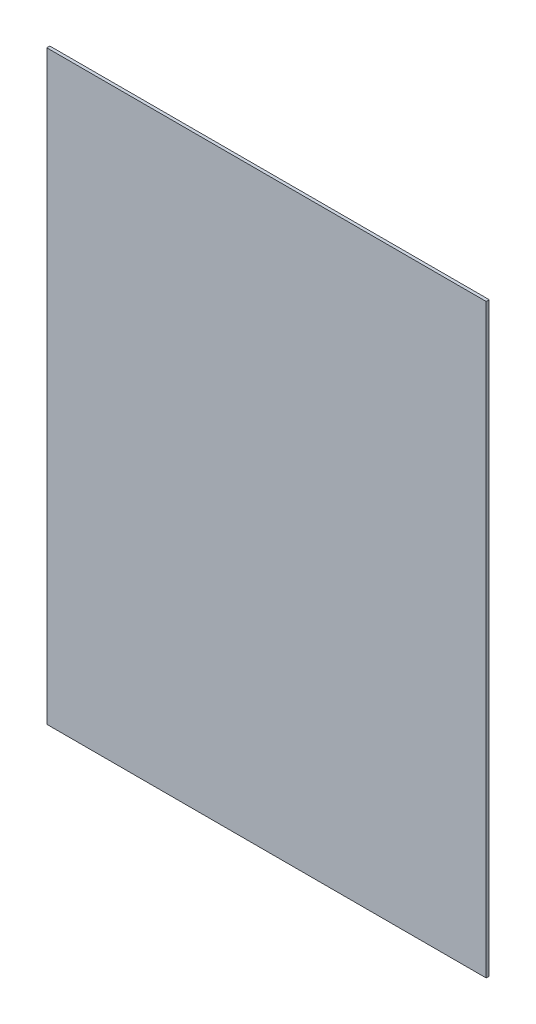
ISO-10303-21;
HEADER;
FILE_DESCRIPTION(('STEP AP214'),'2;1');
FILE_NAME('part.step','',(''),(''),'','','');
FILE_SCHEMA(('AUTOMOTIVE_DESIGN { 1 0 10303 214 1 1 1 1 }'));
ENDSEC;
DATA;
#1=APPLICATION_CONTEXT('core data for automotive mechanical design processes');
#2=APPLICATION_PROTOCOL_DEFINITION('international standard','automotive_design',2000,#1);
#3=PRODUCT_CONTEXT('',#1,'mechanical');
#4=PRODUCT('Part','Part','',(#3));
#5=PRODUCT_RELATED_PRODUCT_CATEGORY('part','',(#4));
#6=PRODUCT_DEFINITION_FORMATION('','',#4);
#7=PRODUCT_DEFINITION_CONTEXT('part definition',#1,'design');
#8=PRODUCT_DEFINITION('design','',#6,#7);
#9=PRODUCT_DEFINITION_SHAPE('','',#8);
#10=(LENGTH_UNIT() NAMED_UNIT(*) SI_UNIT(.MILLI.,.METRE.));
#11=(NAMED_UNIT(*) PLANE_ANGLE_UNIT() SI_UNIT($,.RADIAN.));
#12=(NAMED_UNIT(*) SI_UNIT($,.STERADIAN.) SOLID_ANGLE_UNIT());
#13=UNCERTAINTY_MEASURE_WITH_UNIT(LENGTH_MEASURE(1.E-05),#10,'distance_accuracy_value','');
#14=(GEOMETRIC_REPRESENTATION_CONTEXT(3) GLOBAL_UNCERTAINTY_ASSIGNED_CONTEXT((#13)) GLOBAL_UNIT_ASSIGNED_CONTEXT((#10,
#11,#12)) REPRESENTATION_CONTEXT('',''));
#15=CARTESIAN_POINT('',(0.,0.,0.));
#16=DIRECTION('',(0.,0.,1.));
#17=DIRECTION('',(1.,0.,0.));
#18=AXIS2_PLACEMENT_3D('',#15,#16,#17);
#19=CARTESIAN_POINT('',(457.2,609.6,6.35));
#20=DIRECTION('',(-1.,0.,0.));
#21=DIRECTION('',(0.,0.,1.));
#22=AXIS2_PLACEMENT_3D('',#19,#20,#21);
#23=PLANE('',#22);
#24=DIRECTION('',(0.,1.,0.));
#25=VECTOR('',#24,1.);
#26=CARTESIAN_POINT('',(457.2,609.6,0.));
#27=LINE('',#26,#25);
#28=CARTESIAN_POINT('',(457.2,-609.6,0.));
#29=VERTEX_POINT('',#28);
#30=CARTESIAN_POINT('',(457.2,609.6,0.));
#31=VERTEX_POINT('',#30);
#32=EDGE_CURVE('E99',#29,#31,#27,.T.);
#33=ORIENTED_EDGE('',*,*,#32,.T.);
#34=DIRECTION('',(0.,0.,-1.));
#35=VECTOR('',#34,1.);
#36=CARTESIAN_POINT('',(457.2,609.6,6.35));
#37=LINE('',#36,#35);
#38=CARTESIAN_POINT('',(457.2,609.6,6.35));
#39=VERTEX_POINT('',#38);
#40=EDGE_CURVE('E11',#39,#31,#37,.T.);
#41=ORIENTED_EDGE('',*,*,#40,.F.);
#42=DIRECTION('',(0.,1.,0.));
#43=VECTOR('',#42,1.);
#44=CARTESIAN_POINT('',(457.2,609.6,6.35));
#45=LINE('',#44,#43);
#46=CARTESIAN_POINT('',(457.2,-609.6,6.35));
#47=VERTEX_POINT('',#46);
#48=EDGE_CURVE('E87',#47,#39,#45,.T.);
#49=ORIENTED_EDGE('',*,*,#48,.F.);
#50=DIRECTION('',(0.,0.,-1.));
#51=VECTOR('',#50,1.);
#52=CARTESIAN_POINT('',(457.2,-609.6,6.35));
#53=LINE('',#52,#51);
#54=EDGE_CURVE('E95',#47,#29,#53,.T.);
#55=ORIENTED_EDGE('',*,*,#54,.T.);
#56=EDGE_LOOP('',(#33,#41,#49,#55));
#57=FACE_BOUND('',#56,.T.);
#58=ADVANCED_FACE('F36',(#57),#23,.F.);
#59=CARTESIAN_POINT('',(-457.2,609.6,6.35));
#60=DIRECTION('',(0.,-1.,0.));
#61=DIRECTION('',(0.,0.,-1.));
#62=AXIS2_PLACEMENT_3D('',#59,#60,#61);
#63=PLANE('',#62);
#64=DIRECTION('',(-1.,0.,0.));
#65=VECTOR('',#64,1.);
#66=CARTESIAN_POINT('',(-457.2,609.6,0.));
#67=LINE('',#66,#65);
#68=CARTESIAN_POINT('',(-457.2,609.6,0.));
#69=VERTEX_POINT('',#68);
#70=EDGE_CURVE('E91',#31,#69,#67,.T.);
#71=ORIENTED_EDGE('',*,*,#70,.T.);
#72=DIRECTION('',(0.,0.,-1.));
#73=VECTOR('',#72,1.);
#74=CARTESIAN_POINT('',(-457.2,609.6,6.35));
#75=LINE('',#74,#73);
#76=CARTESIAN_POINT('',(-457.2,609.6,6.35));
#77=VERTEX_POINT('',#76);
#78=EDGE_CURVE('E44',#77,#69,#75,.T.);
#79=ORIENTED_EDGE('',*,*,#78,.F.);
#80=DIRECTION('',(-1.,0.,0.));
#81=VECTOR('',#80,1.);
#82=CARTESIAN_POINT('',(-457.2,609.6,6.35));
#83=LINE('',#82,#81);
#84=EDGE_CURVE('E82',#39,#77,#83,.T.);
#85=ORIENTED_EDGE('',*,*,#84,.F.);
#86=ORIENTED_EDGE('',*,*,#40,.T.);
#87=EDGE_LOOP('',(#71,#79,#85,#86));
#88=FACE_BOUND('',#87,.T.);
#89=ADVANCED_FACE('F90',(#88),#63,.F.);
#90=CARTESIAN_POINT('',(-457.2,609.6,6.35));
#91=DIRECTION('',(1.,0.,0.));
#92=DIRECTION('',(0.,0.,-1.));
#93=AXIS2_PLACEMENT_3D('',#90,#91,#92);
#94=PLANE('',#93);
#95=DIRECTION('',(0.,-1.,0.));
#96=VECTOR('',#95,1.);
#97=CARTESIAN_POINT('',(-457.2,609.6,0.));
#98=LINE('',#97,#96);
#99=CARTESIAN_POINT('',(-457.2,-609.6,0.));
#100=VERTEX_POINT('',#99);
#101=EDGE_CURVE('E69',#69,#100,#98,.T.);
#102=ORIENTED_EDGE('',*,*,#101,.T.);
#103=DIRECTION('',(0.,0.,-1.));
#104=VECTOR('',#103,1.);
#105=CARTESIAN_POINT('',(-457.2,-609.6,6.35));
#106=LINE('',#105,#104);
#107=CARTESIAN_POINT('',(-457.2,-609.6,6.35));
#108=VERTEX_POINT('',#107);
#109=EDGE_CURVE('E92',#108,#100,#106,.T.);
#110=ORIENTED_EDGE('',*,*,#109,.F.);
#111=DIRECTION('',(0.,-1.,0.));
#112=VECTOR('',#111,1.);
#113=CARTESIAN_POINT('',(-457.2,609.6,6.35));
#114=LINE('',#113,#112);
#115=EDGE_CURVE('E85',#77,#108,#114,.T.);
#116=ORIENTED_EDGE('',*,*,#115,.F.);
#117=ORIENTED_EDGE('',*,*,#78,.T.);
#118=EDGE_LOOP('',(#102,#110,#116,#117));
#119=FACE_BOUND('',#118,.T.);
#120=ADVANCED_FACE('F93',(#119),#94,.F.);
#121=CARTESIAN_POINT('',(-457.2,-609.6,6.35));
#122=DIRECTION('',(0.,1.,0.));
#123=DIRECTION('',(0.,0.,1.));
#124=AXIS2_PLACEMENT_3D('',#121,#122,#123);
#125=PLANE('',#124);
#126=DIRECTION('',(1.,0.,0.));
#127=VECTOR('',#126,1.);
#128=CARTESIAN_POINT('',(-457.2,-609.6,0.));
#129=LINE('',#128,#127);
#130=EDGE_CURVE('E75',#100,#29,#129,.T.);
#131=ORIENTED_EDGE('',*,*,#130,.T.);
#132=ORIENTED_EDGE('',*,*,#54,.F.);
#133=DIRECTION('',(1.,0.,0.));
#134=VECTOR('',#133,1.);
#135=CARTESIAN_POINT('',(-457.2,-609.6,6.35));
#136=LINE('',#135,#134);
#137=EDGE_CURVE('E52',#108,#47,#136,.T.);
#138=ORIENTED_EDGE('',*,*,#137,.F.);
#139=ORIENTED_EDGE('',*,*,#109,.T.);
#140=EDGE_LOOP('',(#131,#132,#138,#139));
#141=FACE_BOUND('',#140,.T.);
#142=ADVANCED_FACE('F106',(#141),#125,.F.);
#143=CARTESIAN_POINT('',(0.,0.,6.35));
#144=DIRECTION('',(0.,0.,1.));
#145=DIRECTION('',(1.,0.,0.));
#146=AXIS2_PLACEMENT_3D('',#143,#144,#145);
#147=PLANE('',#146);
#148=ORIENTED_EDGE('',*,*,#48,.T.);
#149=ORIENTED_EDGE('',*,*,#84,.T.);
#150=ORIENTED_EDGE('',*,*,#115,.T.);
#151=ORIENTED_EDGE('',*,*,#137,.T.);
#152=EDGE_LOOP('',(#148,#149,#150,#151));
#153=FACE_BOUND('',#152,.T.);
#154=ADVANCED_FACE('F83',(#153),#147,.T.);
#155=CARTESIAN_POINT('',(0.,0.,0.));
#156=DIRECTION('',(0.,0.,1.));
#157=DIRECTION('',(1.,0.,0.));
#158=AXIS2_PLACEMENT_3D('',#155,#156,#157);
#159=PLANE('',#158);
#160=ORIENTED_EDGE('',*,*,#32,.F.);
#161=ORIENTED_EDGE('',*,*,#130,.F.);
#162=ORIENTED_EDGE('',*,*,#101,.F.);
#163=ORIENTED_EDGE('',*,*,#70,.F.);
#164=EDGE_LOOP('',(#160,#161,#162,#163));
#165=FACE_BOUND('',#164,.T.);
#166=ADVANCED_FACE('F109',(#165),#159,.F.);
#167=CLOSED_SHELL('',(#58,#89,#120,#142,#154,#166));
#168=MANIFOLD_SOLID_BREP('B2',#167);
#169=ADVANCED_BREP_SHAPE_REPRESENTATION('',(#18,#168),#14);
#170=SHAPE_DEFINITION_REPRESENTATION(#9,#169);
ENDSEC;
END-ISO-10303-21;
